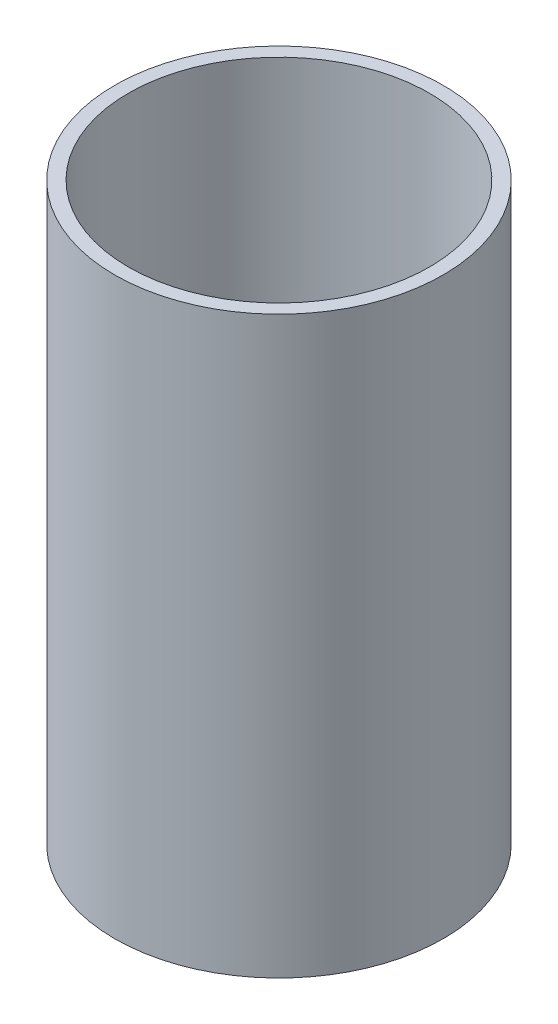
ISO-10303-21;
HEADER;
FILE_DESCRIPTION(('STEP AP214'),'2;1');
FILE_NAME('part.step','',(''),(''),'','','');
FILE_SCHEMA(('AUTOMOTIVE_DESIGN { 1 0 10303 214 1 1 1 1 }'));
ENDSEC;
DATA;
#1=APPLICATION_CONTEXT('core data for automotive mechanical design processes');
#2=APPLICATION_PROTOCOL_DEFINITION('international standard','automotive_design',2000,#1);
#3=PRODUCT_CONTEXT('',#1,'mechanical');
#4=PRODUCT('Part','Part','',(#3));
#5=PRODUCT_RELATED_PRODUCT_CATEGORY('part','',(#4));
#6=PRODUCT_DEFINITION_FORMATION('','',#4);
#7=PRODUCT_DEFINITION_CONTEXT('part definition',#1,'design');
#8=PRODUCT_DEFINITION('design','',#6,#7);
#9=PRODUCT_DEFINITION_SHAPE('','',#8);
#10=(LENGTH_UNIT() NAMED_UNIT(*) SI_UNIT(.MILLI.,.METRE.));
#11=(NAMED_UNIT(*) PLANE_ANGLE_UNIT() SI_UNIT($,.RADIAN.));
#12=(NAMED_UNIT(*) SI_UNIT($,.STERADIAN.) SOLID_ANGLE_UNIT());
#13=UNCERTAINTY_MEASURE_WITH_UNIT(LENGTH_MEASURE(1.E-05),#10,'distance_accuracy_value','');
#14=(GEOMETRIC_REPRESENTATION_CONTEXT(3) GLOBAL_UNCERTAINTY_ASSIGNED_CONTEXT((#13)) GLOBAL_UNIT_ASSIGNED_CONTEXT((#10,
#11,#12)) REPRESENTATION_CONTEXT('',''));
#15=CARTESIAN_POINT('',(0.,0.,0.));
#16=DIRECTION('',(0.,0.,1.));
#17=DIRECTION('',(1.,0.,0.));
#18=AXIS2_PLACEMENT_3D('',#15,#16,#17);
#19=CARTESIAN_POINT('',(0.,-42.,0.));
#20=DIRECTION('',(0.,1.,0.));
#21=DIRECTION('',(0.,0.,1.));
#22=AXIS2_PLACEMENT_3D('',#19,#20,#21);
#23=CYLINDRICAL_SURFACE('',#22,12.);
#24=CARTESIAN_POINT('',(0.,-42.,0.));
#25=DIRECTION('',(0.,1.,0.));
#26=DIRECTION('',(0.,0.,1.));
#27=AXIS2_PLACEMENT_3D('',#24,#25,#26);
#28=CIRCLE('',#27,12.);
#29=CARTESIAN_POINT('',(0.,-42.,12.));
#30=VERTEX_POINT('',#29);
#31=EDGE_CURVE('E10',#30,#30,#28,.T.);
#32=CARTESIAN_POINT('',(0.,0.,0.));
#33=DIRECTION('',(0.,1.,0.));
#34=DIRECTION('',(0.,0.,1.));
#35=AXIS2_PLACEMENT_3D('',#32,#33,#34);
#36=CIRCLE('',#35,12.);
#37=CARTESIAN_POINT('',(0.,0.,12.));
#38=VERTEX_POINT('',#37);
#39=EDGE_CURVE('E35',#38,#38,#36,.T.);
#40=CARTESIAN_POINT('',(0.,-42.,12.));
#41=CARTESIAN_POINT('',(0.,-41.5625,12.));
#42=CARTESIAN_POINT('',(0.,-41.125,12.));
#43=CARTESIAN_POINT('',(0.,-40.25,12.));
#44=CARTESIAN_POINT('',(0.,-39.8125,12.));
#45=CARTESIAN_POINT('',(0.,-38.9375,12.));
#46=CARTESIAN_POINT('',(0.,-38.5,12.));
#47=CARTESIAN_POINT('',(0.,-37.625,12.));
#48=CARTESIAN_POINT('',(0.,-37.1875,12.));
#49=CARTESIAN_POINT('',(0.,-36.3125,12.));
#50=CARTESIAN_POINT('',(0.,-35.875,12.));
#51=CARTESIAN_POINT('',(0.,-35.,12.));
#52=CARTESIAN_POINT('',(0.,-34.5625,12.));
#53=CARTESIAN_POINT('',(0.,-33.6875,12.));
#54=CARTESIAN_POINT('',(0.,-33.25,12.));
#55=CARTESIAN_POINT('',(0.,-32.375,12.));
#56=CARTESIAN_POINT('',(0.,-31.9375,12.));
#57=CARTESIAN_POINT('',(0.,-31.0625,12.));
#58=CARTESIAN_POINT('',(0.,-30.625,12.));
#59=CARTESIAN_POINT('',(0.,-29.75,12.));
#60=CARTESIAN_POINT('',(0.,-29.3125,12.));
#61=CARTESIAN_POINT('',(0.,-28.4375,12.));
#62=CARTESIAN_POINT('',(0.,-28.,12.));
#63=CARTESIAN_POINT('',(0.,-27.125,12.));
#64=CARTESIAN_POINT('',(0.,-26.6875,12.));
#65=CARTESIAN_POINT('',(0.,-25.8125,12.));
#66=CARTESIAN_POINT('',(0.,-25.375,12.));
#67=CARTESIAN_POINT('',(0.,-24.5,12.));
#68=CARTESIAN_POINT('',(0.,-24.0625,12.));
#69=CARTESIAN_POINT('',(0.,-23.1875,12.));
#70=CARTESIAN_POINT('',(0.,-22.75,12.));
#71=CARTESIAN_POINT('',(0.,-21.875,12.));
#72=CARTESIAN_POINT('',(0.,-21.4375,12.));
#73=CARTESIAN_POINT('',(0.,-20.5625,12.));
#74=CARTESIAN_POINT('',(0.,-20.125,12.));
#75=CARTESIAN_POINT('',(0.,-19.25,12.));
#76=CARTESIAN_POINT('',(0.,-18.8125,12.));
#77=CARTESIAN_POINT('',(0.,-17.9375,12.));
#78=CARTESIAN_POINT('',(0.,-17.5,12.));
#79=CARTESIAN_POINT('',(0.,-16.625,12.));
#80=CARTESIAN_POINT('',(0.,-16.1875,12.));
#81=CARTESIAN_POINT('',(0.,-15.3125,12.));
#82=CARTESIAN_POINT('',(0.,-14.875,12.));
#83=CARTESIAN_POINT('',(0.,-14.,12.));
#84=CARTESIAN_POINT('',(0.,-13.5625,12.));
#85=CARTESIAN_POINT('',(0.,-12.6875,12.));
#86=CARTESIAN_POINT('',(0.,-12.25,12.));
#87=CARTESIAN_POINT('',(0.,-11.375,12.));
#88=CARTESIAN_POINT('',(0.,-10.9375,12.));
#89=CARTESIAN_POINT('',(0.,-10.0625,12.));
#90=CARTESIAN_POINT('',(0.,-9.62500000000001,12.));
#91=CARTESIAN_POINT('',(0.,-8.75000000000001,12.));
#92=CARTESIAN_POINT('',(0.,-8.31250000000001,12.));
#93=CARTESIAN_POINT('',(0.,-7.43750000000001,12.));
#94=CARTESIAN_POINT('',(0.,-7.00000000000001,12.));
#95=CARTESIAN_POINT('',(0.,-6.12500000000001,12.));
#96=CARTESIAN_POINT('',(0.,-5.68750000000001,12.));
#97=CARTESIAN_POINT('',(0.,-4.81250000000001,12.));
#98=CARTESIAN_POINT('',(0.,-4.37500000000001,12.));
#99=CARTESIAN_POINT('',(0.,-3.50000000000001,12.));
#100=CARTESIAN_POINT('',(0.,-3.06250000000001,12.));
#101=CARTESIAN_POINT('',(0.,-2.18750000000001,12.));
#102=CARTESIAN_POINT('',(0.,-1.75000000000001,12.));
#103=CARTESIAN_POINT('',(0.,-0.875000000000008,12.));
#104=CARTESIAN_POINT('',(0.,-0.437500000000007,12.));
#105=CARTESIAN_POINT('',(0.,0.,12.));
#106=B_SPLINE_CURVE_WITH_KNOTS('',3,(#40,#41,#42,#43,#44,#45,#46,#47,#48,#49,#50,#51,#52,#53,
#54,#55,#56,#57,#58,#59,#60,#61,#62,#63,#64,#65,#66,#67,#68,#69,#70,#71,#72,#73,#74,#75,#76,#77,
#78,#79,#80,#81,#82,#83,#84,#85,#86,#87,#88,#89,#90,#91,#92,#93,#94,#95,#96,#97,#98,#99,#100,
#101,#102,#103,#104,#105),.UNSPECIFIED.,.F.,.F.,(4,2,2,2,2,2,2,2,2,2,2,2,2,2,2,2,2,2,2,2,2,2,2,
2,2,2,2,2,2,2,2,2,4),(0.,1.31249999999999,2.625,3.9375,5.25,6.5625,7.87499999999999,
9.18749999999999,10.5,11.8125,13.125,14.4375,15.75,17.0625,18.375,19.6875,21.,22.3125,23.625,
24.9375,26.25,27.5625,28.875,30.1875,31.5,32.8125,34.125,35.4375,36.75,38.0625,39.375,40.6875,
42.),.UNSPECIFIED.);
#107=EDGE_CURVE('BSEAM32',#30,#38,#106,.T.);
#108=ORIENTED_EDGE('',*,*,#31,.T.);
#109=ORIENTED_EDGE('',*,*,#39,.F.);
#110=ORIENTED_EDGE('',*,*,#107,.T.);
#111=ORIENTED_EDGE('',*,*,#107,.F.);
#112=EDGE_LOOP('',(#108,#110,#109,#111));
#113=FACE_BOUND('',#112,.T.);
#114=ADVANCED_FACE('F32',(#113),#23,.T.);
#115=CARTESIAN_POINT('',(0.,-42.,0.));
#116=DIRECTION('',(0.,1.,0.));
#117=DIRECTION('',(0.,0.,1.));
#118=AXIS2_PLACEMENT_3D('',#115,#116,#117);
#119=PLANE('',#118);
#120=CARTESIAN_POINT('',(0.,-42.,0.));
#121=DIRECTION('',(0.,1.,0.));
#122=DIRECTION('',(0.,0.,1.));
#123=AXIS2_PLACEMENT_3D('',#120,#121,#122);
#124=CIRCLE('',#123,11.);
#125=CARTESIAN_POINT('',(0.,-42.,11.));
#126=VERTEX_POINT('',#125);
#127=EDGE_CURVE('E45',#126,#126,#124,.T.);
#128=ORIENTED_EDGE('',*,*,#127,.T.);
#129=EDGE_LOOP('',(#128));
#130=FACE_BOUND('',#129,.T.);
#131=ORIENTED_EDGE('',*,*,#31,.F.);
#132=EDGE_LOOP('',(#131));
#133=FACE_BOUND('',#132,.T.);
#134=ADVANCED_FACE('F56',(#130,#133),#119,.F.);
#135=CARTESIAN_POINT('',(0.,0.,0.));
#136=DIRECTION('',(0.,1.,0.));
#137=DIRECTION('',(0.,0.,1.));
#138=AXIS2_PLACEMENT_3D('',#135,#136,#137);
#139=PLANE('',#138);
#140=CARTESIAN_POINT('',(0.,0.,0.));
#141=DIRECTION('',(0.,1.,0.));
#142=DIRECTION('',(0.,0.,1.));
#143=AXIS2_PLACEMENT_3D('',#140,#141,#142);
#144=CIRCLE('',#143,11.);
#145=CARTESIAN_POINT('',(0.,0.,11.));
#146=VERTEX_POINT('',#145);
#147=EDGE_CURVE('E47',#146,#146,#144,.T.);
#148=ORIENTED_EDGE('',*,*,#147,.F.);
#149=EDGE_LOOP('',(#148));
#150=FACE_BOUND('',#149,.T.);
#151=ORIENTED_EDGE('',*,*,#39,.T.);
#152=EDGE_LOOP('',(#151));
#153=FACE_BOUND('',#152,.T.);
#154=ADVANCED_FACE('F62',(#150,#153),#139,.T.);
#155=CARTESIAN_POINT('',(0.,-42.,0.));
#156=DIRECTION('',(0.,1.,0.));
#157=DIRECTION('',(0.,0.,1.));
#158=AXIS2_PLACEMENT_3D('',#155,#156,#157);
#159=CYLINDRICAL_SURFACE('',#158,11.);
#160=CARTESIAN_POINT('',(0.,-42.,11.));
#161=CARTESIAN_POINT('',(0.,-41.5625,11.));
#162=CARTESIAN_POINT('',(0.,-41.125,11.));
#163=CARTESIAN_POINT('',(0.,-40.25,11.));
#164=CARTESIAN_POINT('',(0.,-39.8125,11.));
#165=CARTESIAN_POINT('',(0.,-38.9375,11.));
#166=CARTESIAN_POINT('',(0.,-38.5,11.));
#167=CARTESIAN_POINT('',(0.,-37.625,11.));
#168=CARTESIAN_POINT('',(0.,-37.1875,11.));
#169=CARTESIAN_POINT('',(0.,-36.3125,11.));
#170=CARTESIAN_POINT('',(0.,-35.875,11.));
#171=CARTESIAN_POINT('',(0.,-35.,11.));
#172=CARTESIAN_POINT('',(0.,-34.5625,11.));
#173=CARTESIAN_POINT('',(0.,-33.6875,11.));
#174=CARTESIAN_POINT('',(0.,-33.25,11.));
#175=CARTESIAN_POINT('',(0.,-32.375,11.));
#176=CARTESIAN_POINT('',(0.,-31.9375,11.));
#177=CARTESIAN_POINT('',(0.,-31.0625,11.));
#178=CARTESIAN_POINT('',(0.,-30.625,11.));
#179=CARTESIAN_POINT('',(0.,-29.75,11.));
#180=CARTESIAN_POINT('',(0.,-29.3125,11.));
#181=CARTESIAN_POINT('',(0.,-28.4375,11.));
#182=CARTESIAN_POINT('',(0.,-28.,11.));
#183=CARTESIAN_POINT('',(0.,-27.125,11.));
#184=CARTESIAN_POINT('',(0.,-26.6875,11.));
#185=CARTESIAN_POINT('',(0.,-25.8125,11.));
#186=CARTESIAN_POINT('',(0.,-25.375,11.));
#187=CARTESIAN_POINT('',(0.,-24.5,11.));
#188=CARTESIAN_POINT('',(0.,-24.0625,11.));
#189=CARTESIAN_POINT('',(0.,-23.1875,11.));
#190=CARTESIAN_POINT('',(0.,-22.75,11.));
#191=CARTESIAN_POINT('',(0.,-21.875,11.));
#192=CARTESIAN_POINT('',(0.,-21.4375,11.));
#193=CARTESIAN_POINT('',(0.,-20.5625,11.));
#194=CARTESIAN_POINT('',(0.,-20.125,11.));
#195=CARTESIAN_POINT('',(0.,-19.25,11.));
#196=CARTESIAN_POINT('',(0.,-18.8125,11.));
#197=CARTESIAN_POINT('',(0.,-17.9375,11.));
#198=CARTESIAN_POINT('',(0.,-17.5,11.));
#199=CARTESIAN_POINT('',(0.,-16.625,11.));
#200=CARTESIAN_POINT('',(0.,-16.1875,11.));
#201=CARTESIAN_POINT('',(0.,-15.3125,11.));
#202=CARTESIAN_POINT('',(0.,-14.875,11.));
#203=CARTESIAN_POINT('',(0.,-14.,11.));
#204=CARTESIAN_POINT('',(0.,-13.5625,11.));
#205=CARTESIAN_POINT('',(0.,-12.6875,11.));
#206=CARTESIAN_POINT('',(0.,-12.25,11.));
#207=CARTESIAN_POINT('',(0.,-11.375,11.));
#208=CARTESIAN_POINT('',(0.,-10.9375,11.));
#209=CARTESIAN_POINT('',(0.,-10.0625,11.));
#210=CARTESIAN_POINT('',(0.,-9.62500000000001,11.));
#211=CARTESIAN_POINT('',(0.,-8.75000000000001,11.));
#212=CARTESIAN_POINT('',(0.,-8.31250000000001,11.));
#213=CARTESIAN_POINT('',(0.,-7.43750000000001,11.));
#214=CARTESIAN_POINT('',(0.,-7.00000000000001,11.));
#215=CARTESIAN_POINT('',(0.,-6.12500000000001,11.));
#216=CARTESIAN_POINT('',(0.,-5.68750000000001,11.));
#217=CARTESIAN_POINT('',(0.,-4.81250000000001,11.));
#218=CARTESIAN_POINT('',(0.,-4.37500000000001,11.));
#219=CARTESIAN_POINT('',(0.,-3.50000000000001,11.));
#220=CARTESIAN_POINT('',(0.,-3.06250000000001,11.));
#221=CARTESIAN_POINT('',(0.,-2.18750000000001,11.));
#222=CARTESIAN_POINT('',(0.,-1.75000000000001,11.));
#223=CARTESIAN_POINT('',(0.,-0.875000000000008,11.));
#224=CARTESIAN_POINT('',(0.,-0.437500000000007,11.));
#225=CARTESIAN_POINT('',(0.,0.,11.));
#226=B_SPLINE_CURVE_WITH_KNOTS('',3,(#160,#161,#162,#163,#164,#165,#166,#167,#168,#169,#170,
#171,#172,#173,#174,#175,#176,#177,#178,#179,#180,#181,#182,#183,#184,#185,#186,#187,#188,#189,
#190,#191,#192,#193,#194,#195,#196,#197,#198,#199,#200,#201,#202,#203,#204,#205,#206,#207,#208,
#209,#210,#211,#212,#213,#214,#215,#216,#217,#218,#219,#220,#221,#222,#223,#224,#225),
.UNSPECIFIED.,.F.,.F.,(4,2,2,2,2,2,2,2,2,2,2,2,2,2,2,2,2,2,2,2,2,2,2,2,2,2,2,2,2,2,2,2,4),(0.,
1.3125,2.625,3.9375,5.25,6.56250000000001,7.87500000000001,9.18750000000001,10.5,11.8125,13.125,
14.4375,15.75,17.0625,18.375,19.6875,21.,22.3125,23.625,24.9375,26.25,27.5625,28.875,30.1875,
31.5,32.8125,34.125,35.4375,36.75,38.0625,39.375,40.6875,42.),.UNSPECIFIED.);
#227=EDGE_CURVE('BSEAM59',#126,#146,#226,.T.);
#228=ORIENTED_EDGE('',*,*,#127,.F.);
#229=ORIENTED_EDGE('',*,*,#147,.T.);
#230=ORIENTED_EDGE('',*,*,#227,.T.);
#231=ORIENTED_EDGE('',*,*,#227,.F.);
#232=EDGE_LOOP('',(#228,#230,#229,#231));
#233=FACE_BOUND('',#232,.T.);
#234=ADVANCED_FACE('F59',(#233),#159,.F.);
#235=CLOSED_SHELL('',(#114,#134,#154,#234));
#236=MANIFOLD_SOLID_BREP('B2',#235);
#237=ADVANCED_BREP_SHAPE_REPRESENTATION('',(#18,#236),#14);
#238=SHAPE_DEFINITION_REPRESENTATION(#9,#237);
ENDSEC;
END-ISO-10303-21;
